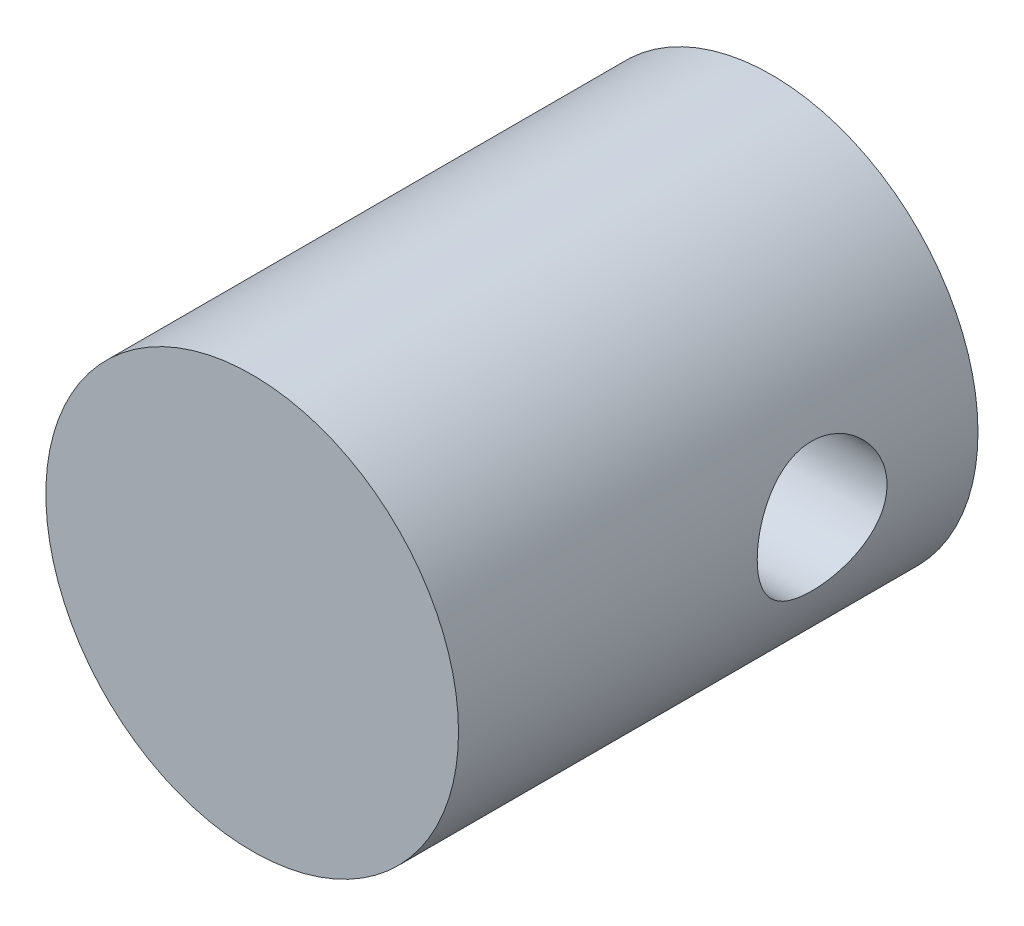
ISO-10303-21;
HEADER;
FILE_DESCRIPTION(('STEP AP214'),'2;1');
FILE_NAME('part.step','',(''),(''),'','','');
FILE_SCHEMA(('AUTOMOTIVE_DESIGN { 1 0 10303 214 1 1 1 1 }'));
ENDSEC;
DATA;
#1=APPLICATION_CONTEXT('core data for automotive mechanical design processes');
#2=APPLICATION_PROTOCOL_DEFINITION('international standard','automotive_design',2000,#1);
#3=PRODUCT_CONTEXT('',#1,'mechanical');
#4=PRODUCT('Part','Part','',(#3));
#5=PRODUCT_RELATED_PRODUCT_CATEGORY('part','',(#4));
#6=PRODUCT_DEFINITION_FORMATION('','',#4);
#7=PRODUCT_DEFINITION_CONTEXT('part definition',#1,'design');
#8=PRODUCT_DEFINITION('design','',#6,#7);
#9=PRODUCT_DEFINITION_SHAPE('','',#8);
#10=(LENGTH_UNIT() NAMED_UNIT(*) SI_UNIT(.MILLI.,.METRE.));
#11=(NAMED_UNIT(*) PLANE_ANGLE_UNIT() SI_UNIT($,.RADIAN.));
#12=(NAMED_UNIT(*) SI_UNIT($,.STERADIAN.) SOLID_ANGLE_UNIT());
#13=UNCERTAINTY_MEASURE_WITH_UNIT(LENGTH_MEASURE(1.E-05),#10,'distance_accuracy_value','');
#14=(GEOMETRIC_REPRESENTATION_CONTEXT(3) GLOBAL_UNCERTAINTY_ASSIGNED_CONTEXT((#13)) GLOBAL_UNIT_ASSIGNED_CONTEXT((#10,
#11,#12)) REPRESENTATION_CONTEXT('',''));
#15=CARTESIAN_POINT('',(0.,0.,0.));
#16=DIRECTION('',(0.,0.,1.));
#17=DIRECTION('',(1.,0.,0.));
#18=AXIS2_PLACEMENT_3D('',#15,#16,#17);
#19=CARTESIAN_POINT('',(0.,0.,31.75));
#20=DIRECTION('',(0.,0.,-1.));
#21=DIRECTION('',(-1.,0.,0.));
#22=AXIS2_PLACEMENT_3D('',#19,#20,#21);
#23=CYLINDRICAL_SURFACE('',#22,12.6111);
#24=CARTESIAN_POINT('',(-12.6111,0.,5.55625));
#25=CARTESIAN_POINT('',(-12.6110990721716,0.217217491544255,5.55625118551926));
#26=CARTESIAN_POINT('',(-12.605435018423,0.434447706387787,5.57414180142287));
#27=CARTESIAN_POINT('',(-12.5833952063492,0.862550663298413,5.64504077711127));
#28=CARTESIAN_POINT('',(-12.5670171607227,1.07342203777541,5.69805663572103));
#29=CARTESIAN_POINT('',(-12.525337566619,1.48257230059985,5.83723783008082));
#30=CARTESIAN_POINT('',(-12.5000499508833,1.68087028310371,5.92335142675255));
#31=CARTESIAN_POINT('',(-12.4431590966659,2.06021181573839,6.1260620987035));
#32=CARTESIAN_POINT('',(-12.4115548361673,2.24125256668359,6.24266410787177));
#33=CARTESIAN_POINT('',(-12.3442769297819,2.58660327857524,6.50687950750481));
#34=CARTESIAN_POINT('',(-12.3085136974511,2.75029789910608,6.65527429437142));
#35=CARTESIAN_POINT('',(-12.2374647542068,3.05093599642832,6.97719937490004));
#36=CARTESIAN_POINT('',(-12.2021791349686,3.18787440341785,7.15073442134389));
#37=CARTESIAN_POINT('',(-12.1351168095355,3.4344674346391,7.52336286256474));
#38=CARTESIAN_POINT('',(-12.1034505333758,3.54335014815172,7.72298884499549));
#39=CARTESIAN_POINT('',(-12.0485612110162,3.72574206363655,8.13887616958157));
#40=CARTESIAN_POINT('',(-12.0253359052894,3.79926073376451,8.35513304107814));
#41=CARTESIAN_POINT('',(-11.9908958975844,3.90658016110488,8.79119394042884));
#42=CARTESIAN_POINT('',(-11.9793365744537,3.94152360157614,9.01068876017849));
#43=CARTESIAN_POINT('',(-11.9685145104741,3.9742708146039,9.45270658081214));
#44=CARTESIAN_POINT('',(-11.9692484473686,3.97208462145051,9.67522874731234));
#45=CARTESIAN_POINT('',(-11.9826260073009,3.93152768275585,10.1075028535389));
#46=CARTESIAN_POINT('',(-11.9947902242119,3.89461342036474,10.3174087862098));
#47=CARTESIAN_POINT('',(-12.0288783559661,3.78801118213594,10.7278820371044));
#48=CARTESIAN_POINT('',(-12.050803321431,3.71831967819485,10.9284483474674));
#49=CARTESIAN_POINT('',(-12.1023072854486,3.54712051775415,11.3180020429268));
#50=CARTESIAN_POINT('',(-12.1319945368823,3.44515820036544,11.5067746886314));
#51=CARTESIAN_POINT('',(-12.1956289106089,3.21262748447639,11.8650068928287));
#52=CARTESIAN_POINT('',(-12.2295771515792,3.08205156704099,12.0344613571624));
#53=CARTESIAN_POINT('',(-12.299827822044,2.78886883881817,12.3574760948754));
#54=CARTESIAN_POINT('',(-12.3361665513811,2.62506082601396,12.5099402379108));
#55=CARTESIAN_POINT('',(-12.4057214979653,2.27375011025218,12.7855027136285));
#56=CARTESIAN_POINT('',(-12.4389374771776,2.08624560355352,12.9085988087976));
#57=CARTESIAN_POINT('',(-12.4988617038697,1.69073023692951,13.1226877941217));
#58=CARTESIAN_POINT('',(-12.5255157539188,1.48256730220875,13.2134159332717));
#59=CARTESIAN_POINT('',(-12.5689215147181,1.05289933570009,13.3582404801361));
#60=CARTESIAN_POINT('',(-12.5856762763752,0.831398437814578,13.4123481748211));
#61=CARTESIAN_POINT('',(-12.6069032269399,0.390643824597747,13.4805210319723));
#62=CARTESIAN_POINT('',(-12.6118302519687,0.171641155327319,13.4960697975664));
#63=CARTESIAN_POINT('',(-12.6101937324805,-0.265869464941007,13.4908708775426));
#64=CARTESIAN_POINT('',(-12.6036318929193,-0.484377484527003,13.4701285775453));
#65=CARTESIAN_POINT('',(-12.5800539773208,-0.908951520411593,13.3941256938249));
#66=CARTESIAN_POINT('',(-12.5633063099455,-1.11519241800351,13.3397507641513));
#67=CARTESIAN_POINT('',(-12.5213203606937,-1.51556368041608,13.1991095366479));
#68=CARTESIAN_POINT('',(-12.4960810258812,-1.70969253984737,13.1128392837822));
#69=CARTESIAN_POINT('',(-12.4389313896902,-2.08564032521846,12.9084864160486));
#70=CARTESIAN_POINT('',(-12.4068722965445,-2.26703910952259,12.7896736283729));
#71=CARTESIAN_POINT('',(-12.3397460163234,-2.60782037031937,12.524482445309));
#72=CARTESIAN_POINT('',(-12.3046780039323,-2.76719677480528,12.3780964736342));
#73=CARTESIAN_POINT('',(-12.233709617571,-3.06606518752291,12.0549356992058));
#74=CARTESIAN_POINT('',(-12.1978324977809,-3.20449956376543,11.8771754208033));
#75=CARTESIAN_POINT('',(-12.1307796937189,-3.44967218639508,11.5001684030255));
#76=CARTESIAN_POINT('',(-12.0996039447807,-3.55641086876859,11.300921959252));
#77=CARTESIAN_POINT('',(-12.0458262569185,-3.73451314156461,10.8869649392187));
#78=CARTESIAN_POINT('',(-12.0231925872055,-3.80600795974659,10.6723151907624));
#79=CARTESIAN_POINT('',(-11.9892680844374,-3.9115762014667,10.2331634530374));
#80=CARTESIAN_POINT('',(-11.9779728561085,-3.94566412602425,10.008665316683));
#81=CARTESIAN_POINT('',(-11.96846651198,-3.97440004066252,9.56725856247281));
#82=CARTESIAN_POINT('',(-11.9696790981258,-3.97078510298818,9.35047405758939));
#83=CARTESIAN_POINT('',(-11.9836491974221,-3.92841969286235,8.9207642050005));
#84=CARTESIAN_POINT('',(-11.9964061576428,-3.88967090318319,8.70783867296371));
#85=CARTESIAN_POINT('',(-12.0316221103529,-3.77930769264488,8.29504546965546));
#86=CARTESIAN_POINT('',(-12.0539320863863,-3.7081970520709,8.09502943234446));
#87=CARTESIAN_POINT('',(-12.1057004183112,-3.53552644444059,7.70960831278266));
#88=CARTESIAN_POINT('',(-12.1351602427261,-3.43396022103369,7.52420624250408));
#89=CARTESIAN_POINT('',(-12.1993642540513,-3.19855886803481,7.16532748014489));
#90=CARTESIAN_POINT('',(-12.2342715001741,-3.06360519323822,6.99261373867077));
#91=CARTESIAN_POINT('',(-12.3046944662026,-2.76721997326023,6.67172157282666));
#92=CARTESIAN_POINT('',(-12.3402103474724,-2.60578130586812,6.52354976974915));
#93=CARTESIAN_POINT('',(-12.4092670891043,-2.25454485821966,6.25100700052269));
#94=CARTESIAN_POINT('',(-12.4427028674462,-2.06398201876223,6.12759237023627));
#95=CARTESIAN_POINT('',(-12.50250279623,-1.66376359048108,5.91471050768888));
#96=CARTESIAN_POINT('',(-12.528869628389,-1.45411528258086,5.82523039647313));
#97=CARTESIAN_POINT('',(-12.5698073963476,-1.03909288163997,5.68897819689042));
#98=CARTESIAN_POINT('',(-12.5851564690774,-0.834731067851763,5.63935009905823));
#99=CARTESIAN_POINT('',(-12.6058021681063,-0.420249328894623,5.57298886831371));
#100=CARTESIAN_POINT('',(-12.6111008975574,-0.210130617761915,5.55624885315914));
#101=CARTESIAN_POINT('',(-12.6111,0.,5.55625));
#102=B_SPLINE_CURVE_WITH_KNOTS('',3,(#24,#25,#26,#27,#28,#29,#30,#31,#32,#33,#34,#35,#36,#37,
#38,#39,#40,#41,#42,#43,#44,#45,#46,#47,#48,#49,#50,#51,#52,#53,#54,#55,#56,#57,#58,#59,#60,#61,
#62,#63,#64,#65,#66,#67,#68,#69,#70,#71,#72,#73,#74,#75,#76,#77,#78,#79,#80,#81,#82,#83,#84,#85,
#86,#87,#88,#89,#90,#91,#92,#93,#94,#95,#96,#97,#98,#99,#100,#101),.UNSPECIFIED.,.T.,.F.,(4,2,2,
2,2,2,2,2,2,2,2,2,2,2,2,2,2,2,2,2,2,2,2,2,2,2,2,2,2,2,2,2,2,2,2,2,2,2,4),(0.,0.650880010217013,
1.30189902043229,1.95190445621504,2.6020151464679,3.2704483707711,3.93900812809901,
4.62436468944361,5.30953765528235,5.9738191140538,6.63792105349969,7.27535657538204,
7.91286072577651,8.55977952106903,9.20686851464962,9.88385565166816,10.5608943509914,
11.243350298079,11.9255958060919,12.5811529310708,13.2366127791446,13.8755067325351,
14.5144799356807,15.1691671515884,15.8240345190819,16.5052419853831,17.1864400809809,
17.8650822616508,18.5434612693399,19.1907289094365,19.8379655496149,20.4754541305745,
21.1130737577058,21.7759422958258,22.4389893822842,23.1241053364262,23.8089610119824,
24.4387374056711,25.0683819967372),.UNSPECIFIED.);
#103=CARTESIAN_POINT('',(-12.6111,0.,5.55625));
#104=VERTEX_POINT('',#103);
#105=EDGE_CURVE('E10',#104,#104,#102,.T.);
#106=ORIENTED_EDGE('',*,*,#105,.T.);
#107=EDGE_LOOP('',(#106));
#108=FACE_BOUND('',#107,.T.);
#109=CARTESIAN_POINT('',(12.6111,0.,5.55625));
#110=CARTESIAN_POINT('',(12.6110990721716,-0.217217491544255,5.55625118551926));
#111=CARTESIAN_POINT('',(12.605435018423,-0.434447706387787,5.57414180142287));
#112=CARTESIAN_POINT('',(12.5833952063492,-0.862550663298413,5.64504077711127));
#113=CARTESIAN_POINT('',(12.5670171607227,-1.07342203777541,5.69805663572103));
#114=CARTESIAN_POINT('',(12.525337566619,-1.48257230059985,5.83723783008082));
#115=CARTESIAN_POINT('',(12.5000499508833,-1.68087028310371,5.92335142675255));
#116=CARTESIAN_POINT('',(12.4431590966659,-2.06021181573839,6.1260620987035));
#117=CARTESIAN_POINT('',(12.4115548361673,-2.24125256668359,6.24266410787177));
#118=CARTESIAN_POINT('',(12.3442769297819,-2.58660327857524,6.50687950750481));
#119=CARTESIAN_POINT('',(12.3085136974511,-2.75029789910608,6.65527429437142));
#120=CARTESIAN_POINT('',(12.2374647542068,-3.05093599642832,6.97719937490004));
#121=CARTESIAN_POINT('',(12.2021791349686,-3.18787440341785,7.15073442134389));
#122=CARTESIAN_POINT('',(12.1351168095355,-3.4344674346391,7.52336286256474));
#123=CARTESIAN_POINT('',(12.1034505333758,-3.54335014815172,7.72298884499549));
#124=CARTESIAN_POINT('',(12.0485612110162,-3.72574206363655,8.13887616958157));
#125=CARTESIAN_POINT('',(12.0253359052894,-3.79926073376451,8.35513304107814));
#126=CARTESIAN_POINT('',(11.9908958975844,-3.90658016110488,8.79119394042884));
#127=CARTESIAN_POINT('',(11.9793365744537,-3.94152360157614,9.01068876017849));
#128=CARTESIAN_POINT('',(11.9685145104741,-3.9742708146039,9.45270658081214));
#129=CARTESIAN_POINT('',(11.9692484473686,-3.97208462145051,9.67522874731234));
#130=CARTESIAN_POINT('',(11.9826260073009,-3.93152768275585,10.1075028535389));
#131=CARTESIAN_POINT('',(11.9947902242119,-3.89461342036474,10.3174087862098));
#132=CARTESIAN_POINT('',(12.0288783559661,-3.78801118213594,10.7278820371044));
#133=CARTESIAN_POINT('',(12.050803321431,-3.71831967819485,10.9284483474674));
#134=CARTESIAN_POINT('',(12.1023072854486,-3.54712051775415,11.3180020429268));
#135=CARTESIAN_POINT('',(12.1319945368823,-3.44515820036544,11.5067746886314));
#136=CARTESIAN_POINT('',(12.1956289106089,-3.21262748447639,11.8650068928287));
#137=CARTESIAN_POINT('',(12.2295771515792,-3.08205156704099,12.0344613571624));
#138=CARTESIAN_POINT('',(12.299827822044,-2.78886883881817,12.3574760948754));
#139=CARTESIAN_POINT('',(12.3361665513811,-2.62506082601396,12.5099402379108));
#140=CARTESIAN_POINT('',(12.4057214979653,-2.27375011025218,12.7855027136285));
#141=CARTESIAN_POINT('',(12.4389374771776,-2.08624560355352,12.9085988087976));
#142=CARTESIAN_POINT('',(12.4988617038697,-1.69073023692951,13.1226877941217));
#143=CARTESIAN_POINT('',(12.5255157539188,-1.48256730220875,13.2134159332717));
#144=CARTESIAN_POINT('',(12.5689215147181,-1.05289933570009,13.3582404801361));
#145=CARTESIAN_POINT('',(12.5856762763752,-0.831398437814578,13.4123481748211));
#146=CARTESIAN_POINT('',(12.6069032269399,-0.390643824597747,13.4805210319723));
#147=CARTESIAN_POINT('',(12.6118302519687,-0.171641155327319,13.4960697975664));
#148=CARTESIAN_POINT('',(12.6101937324805,0.265869464941007,13.4908708775426));
#149=CARTESIAN_POINT('',(12.6036318929193,0.484377484527003,13.4701285775453));
#150=CARTESIAN_POINT('',(12.5800539773208,0.908951520411593,13.3941256938249));
#151=CARTESIAN_POINT('',(12.5633063099455,1.11519241800351,13.3397507641513));
#152=CARTESIAN_POINT('',(12.5213203606937,1.51556368041608,13.1991095366479));
#153=CARTESIAN_POINT('',(12.4960810258812,1.70969253984737,13.1128392837822));
#154=CARTESIAN_POINT('',(12.4389313896902,2.08564032521846,12.9084864160486));
#155=CARTESIAN_POINT('',(12.4068722965445,2.26703910952259,12.7896736283729));
#156=CARTESIAN_POINT('',(12.3397460163234,2.60782037031937,12.524482445309));
#157=CARTESIAN_POINT('',(12.3046780039323,2.76719677480528,12.3780964736342));
#158=CARTESIAN_POINT('',(12.233709617571,3.06606518752291,12.0549356992058));
#159=CARTESIAN_POINT('',(12.1978324977809,3.20449956376543,11.8771754208033));
#160=CARTESIAN_POINT('',(12.1307796937189,3.44967218639508,11.5001684030255));
#161=CARTESIAN_POINT('',(12.0996039447807,3.55641086876859,11.300921959252));
#162=CARTESIAN_POINT('',(12.0458262569185,3.73451314156461,10.8869649392187));
#163=CARTESIAN_POINT('',(12.0231925872055,3.80600795974659,10.6723151907624));
#164=CARTESIAN_POINT('',(11.9892680844374,3.9115762014667,10.2331634530374));
#165=CARTESIAN_POINT('',(11.9779728561085,3.94566412602425,10.008665316683));
#166=CARTESIAN_POINT('',(11.96846651198,3.97440004066252,9.56725856247281));
#167=CARTESIAN_POINT('',(11.9696790981258,3.97078510298818,9.35047405758939));
#168=CARTESIAN_POINT('',(11.9836491974221,3.92841969286235,8.9207642050005));
#169=CARTESIAN_POINT('',(11.9964061576428,3.88967090318319,8.70783867296371));
#170=CARTESIAN_POINT('',(12.0316221103529,3.77930769264488,8.29504546965546));
#171=CARTESIAN_POINT('',(12.0539320863863,3.7081970520709,8.09502943234446));
#172=CARTESIAN_POINT('',(12.1057004183112,3.53552644444059,7.70960831278266));
#173=CARTESIAN_POINT('',(12.1351602427261,3.43396022103369,7.52420624250408));
#174=CARTESIAN_POINT('',(12.1993642540513,3.19855886803481,7.16532748014489));
#175=CARTESIAN_POINT('',(12.2342715001741,3.06360519323822,6.99261373867077));
#176=CARTESIAN_POINT('',(12.3046944662026,2.76721997326023,6.67172157282666));
#177=CARTESIAN_POINT('',(12.3402103474724,2.60578130586812,6.52354976974915));
#178=CARTESIAN_POINT('',(12.4092670891043,2.25454485821966,6.25100700052269));
#179=CARTESIAN_POINT('',(12.4427028674462,2.06398201876223,6.12759237023627));
#180=CARTESIAN_POINT('',(12.50250279623,1.66376359048108,5.91471050768888));
#181=CARTESIAN_POINT('',(12.528869628389,1.45411528258086,5.82523039647313));
#182=CARTESIAN_POINT('',(12.5698073963476,1.03909288163997,5.68897819689042));
#183=CARTESIAN_POINT('',(12.5851564690774,0.834731067851763,5.63935009905823));
#184=CARTESIAN_POINT('',(12.6058021681063,0.420249328894623,5.57298886831371));
#185=CARTESIAN_POINT('',(12.6111008975574,0.210130617761915,5.55624885315914));
#186=CARTESIAN_POINT('',(12.6111,0.,5.55625));
#187=B_SPLINE_CURVE_WITH_KNOTS('',3,(#109,#110,#111,#112,#113,#114,#115,#116,#117,#118,#119,
#120,#121,#122,#123,#124,#125,#126,#127,#128,#129,#130,#131,#132,#133,#134,#135,#136,#137,#138,
#139,#140,#141,#142,#143,#144,#145,#146,#147,#148,#149,#150,#151,#152,#153,#154,#155,#156,#157,
#158,#159,#160,#161,#162,#163,#164,#165,#166,#167,#168,#169,#170,#171,#172,#173,#174,#175,#176,
#177,#178,#179,#180,#181,#182,#183,#184,#185,#186),.UNSPECIFIED.,.T.,.F.,(4,2,2,2,2,2,2,2,2,2,2,
2,2,2,2,2,2,2,2,2,2,2,2,2,2,2,2,2,2,2,2,2,2,2,2,2,2,2,4),(0.,0.650880010217013,1.30189902043229,
1.95190445621504,2.6020151464679,3.2704483707711,3.93900812809901,4.62436468944361,
5.30953765528235,5.9738191140538,6.63792105349969,7.27535657538204,7.91286072577651,
8.55977952106903,9.20686851464962,9.88385565166816,10.5608943509914,11.243350298079,
11.9255958060919,12.5811529310708,13.2366127791446,13.8755067325351,14.5144799356807,
15.1691671515884,15.8240345190819,16.5052419853831,17.1864400809809,17.8650822616508,
18.5434612693399,19.1907289094365,19.8379655496149,20.4754541305745,21.1130737577058,
21.7759422958258,22.4389893822842,23.1241053364262,23.8089610119824,24.4387374056711,
25.0683819967372),.UNSPECIFIED.);
#188=CARTESIAN_POINT('',(12.6111,0.,5.55625));
#189=VERTEX_POINT('',#188);
#190=EDGE_CURVE('E54',#189,#189,#187,.T.);
#191=ORIENTED_EDGE('',*,*,#190,.T.);
#192=EDGE_LOOP('',(#191));
#193=FACE_BOUND('',#192,.T.);
#194=CARTESIAN_POINT('',(0.,0.,31.75));
#195=DIRECTION('',(0.,0.,1.));
#196=DIRECTION('',(1.,0.,0.));
#197=AXIS2_PLACEMENT_3D('',#194,#195,#196);
#198=CIRCLE('',#197,12.6111);
#199=CARTESIAN_POINT('',(12.6111,0.,31.75));
#200=VERTEX_POINT('',#199);
#201=EDGE_CURVE('E59',#200,#200,#198,.T.);
#202=ORIENTED_EDGE('',*,*,#201,.F.);
#203=EDGE_LOOP('',(#202));
#204=FACE_BOUND('',#203,.T.);
#205=CARTESIAN_POINT('',(0.,0.,0.));
#206=DIRECTION('',(0.,0.,1.));
#207=DIRECTION('',(1.,0.,0.));
#208=AXIS2_PLACEMENT_3D('',#205,#206,#207);
#209=CIRCLE('',#208,12.6111);
#210=CARTESIAN_POINT('',(12.6111,0.,0.));
#211=VERTEX_POINT('',#210);
#212=EDGE_CURVE('E64',#211,#211,#209,.T.);
#213=ORIENTED_EDGE('',*,*,#212,.T.);
#214=EDGE_LOOP('',(#213));
#215=FACE_BOUND('',#214,.T.);
#216=ADVANCED_FACE('F42',(#108,#193,#204,#215),#23,.T.);
#217=CARTESIAN_POINT('',(0.,0.,31.75));
#218=DIRECTION('',(0.,0.,1.));
#219=DIRECTION('',(1.,0.,0.));
#220=AXIS2_PLACEMENT_3D('',#217,#218,#219);
#221=PLANE('',#220);
#222=ORIENTED_EDGE('',*,*,#201,.T.);
#223=EDGE_LOOP('',(#222));
#224=FACE_BOUND('',#223,.T.);
#225=ADVANCED_FACE('F76',(#224),#221,.T.);
#226=CARTESIAN_POINT('',(0.,0.,0.));
#227=DIRECTION('',(0.,0.,1.));
#228=DIRECTION('',(1.,0.,0.));
#229=AXIS2_PLACEMENT_3D('',#226,#227,#228);
#230=PLANE('',#229);
#231=ORIENTED_EDGE('',*,*,#212,.F.);
#232=EDGE_LOOP('',(#231));
#233=FACE_BOUND('',#232,.T.);
#234=ADVANCED_FACE('F74',(#233),#230,.F.);
#235=CARTESIAN_POINT('',(-12.6111,0.,9.525));
#236=DIRECTION('',(1.,0.,0.));
#237=DIRECTION('',(0.,0.,-1.));
#238=AXIS2_PLACEMENT_3D('',#235,#236,#237);
#239=CYLINDRICAL_SURFACE('',#238,3.96875);
#240=ORIENTED_EDGE('',*,*,#190,.F.);
#241=EDGE_LOOP('',(#240));
#242=FACE_BOUND('',#241,.T.);
#243=ORIENTED_EDGE('',*,*,#105,.F.);
#244=EDGE_LOOP('',(#243));
#245=FACE_BOUND('',#244,.T.);
#246=ADVANCED_FACE('F70',(#242,#245),#239,.F.);
#247=CLOSED_SHELL('',(#216,#225,#234,#246));
#248=MANIFOLD_SOLID_BREP('B2',#247);
#249=ADVANCED_BREP_SHAPE_REPRESENTATION('',(#18,#248),#14);
#250=SHAPE_DEFINITION_REPRESENTATION(#9,#249);
ENDSEC;
END-ISO-10303-21;
